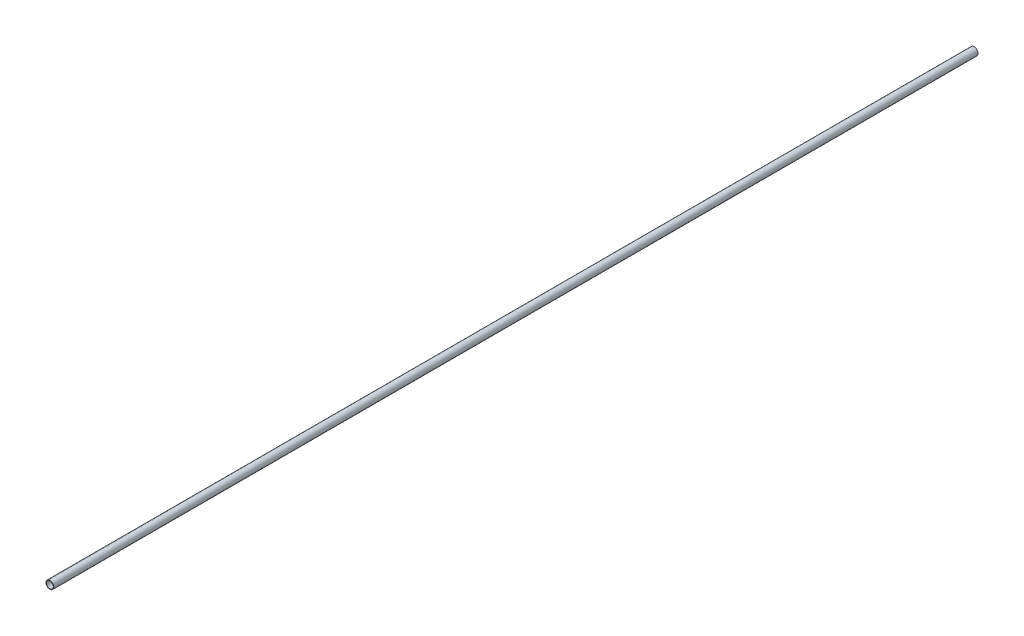
ISO-10303-21;
HEADER;
FILE_DESCRIPTION(('STEP AP214'),'2;1');
FILE_NAME('part.step','',(''),(''),'','','');
FILE_SCHEMA(('AUTOMOTIVE_DESIGN { 1 0 10303 214 1 1 1 1 }'));
ENDSEC;
DATA;
#1=APPLICATION_CONTEXT('core data for automotive mechanical design processes');
#2=APPLICATION_PROTOCOL_DEFINITION('international standard','automotive_design',2000,#1);
#3=PRODUCT_CONTEXT('',#1,'mechanical');
#4=PRODUCT('Part','Part','',(#3));
#5=PRODUCT_RELATED_PRODUCT_CATEGORY('part','',(#4));
#6=PRODUCT_DEFINITION_FORMATION('','',#4);
#7=PRODUCT_DEFINITION_CONTEXT('part definition',#1,'design');
#8=PRODUCT_DEFINITION('design','',#6,#7);
#9=PRODUCT_DEFINITION_SHAPE('','',#8);
#10=(LENGTH_UNIT() NAMED_UNIT(*) SI_UNIT(.MILLI.,.METRE.));
#11=(NAMED_UNIT(*) PLANE_ANGLE_UNIT() SI_UNIT($,.RADIAN.));
#12=(NAMED_UNIT(*) SI_UNIT($,.STERADIAN.) SOLID_ANGLE_UNIT());
#13=UNCERTAINTY_MEASURE_WITH_UNIT(LENGTH_MEASURE(1.E-05),#10,'distance_accuracy_value','');
#14=(GEOMETRIC_REPRESENTATION_CONTEXT(3) GLOBAL_UNCERTAINTY_ASSIGNED_CONTEXT((#13)) GLOBAL_UNIT_ASSIGNED_CONTEXT((#10,
#11,#12)) REPRESENTATION_CONTEXT('',''));
#15=CARTESIAN_POINT('',(0.,0.,0.));
#16=DIRECTION('',(0.,0.,1.));
#17=DIRECTION('',(1.,0.,0.));
#18=AXIS2_PLACEMENT_3D('',#15,#16,#17);
#19=CARTESIAN_POINT('',(0.,0.,-474.25));
#20=DIRECTION('',(0.,0.,1.));
#21=DIRECTION('',(1.,0.,0.));
#22=AXIS2_PLACEMENT_3D('',#19,#20,#21);
#23=CYLINDRICAL_SURFACE('',#22,4.);
#24=CARTESIAN_POINT('',(0.,0.,-474.25));
#25=DIRECTION('',(0.,0.,1.));
#26=DIRECTION('',(1.,0.,0.));
#27=AXIS2_PLACEMENT_3D('',#24,#25,#26);
#28=CIRCLE('',#27,4.);
#29=CARTESIAN_POINT('',(4.,0.,-474.25));
#30=VERTEX_POINT('',#29);
#31=EDGE_CURVE('E10',#30,#30,#28,.T.);
#32=ORIENTED_EDGE('',*,*,#31,.T.);
#33=EDGE_LOOP('',(#32));
#34=FACE_BOUND('',#33,.T.);
#35=CARTESIAN_POINT('',(0.,0.,474.25));
#36=DIRECTION('',(0.,0.,1.));
#37=DIRECTION('',(1.,0.,0.));
#38=AXIS2_PLACEMENT_3D('',#35,#36,#37);
#39=CIRCLE('',#38,4.);
#40=CARTESIAN_POINT('',(4.,0.,474.25));
#41=VERTEX_POINT('',#40);
#42=EDGE_CURVE('E42',#41,#41,#39,.T.);
#43=ORIENTED_EDGE('',*,*,#42,.F.);
#44=EDGE_LOOP('',(#43));
#45=FACE_BOUND('',#44,.T.);
#46=ADVANCED_FACE('F32',(#34,#45),#23,.T.);
#47=CARTESIAN_POINT('',(0.,0.,-474.25));
#48=DIRECTION('',(0.,0.,1.));
#49=DIRECTION('',(1.,0.,0.));
#50=AXIS2_PLACEMENT_3D('',#47,#48,#49);
#51=PLANE('',#50);
#52=CARTESIAN_POINT('',(0.,0.,-474.25));
#53=DIRECTION('',(0.,0.,1.));
#54=DIRECTION('',(1.,0.,0.));
#55=AXIS2_PLACEMENT_3D('',#52,#53,#54);
#56=CIRCLE('',#55,3.5);
#57=CARTESIAN_POINT('',(3.5,0.,-474.25));
#58=VERTEX_POINT('',#57);
#59=EDGE_CURVE('E38',#58,#58,#56,.T.);
#60=ORIENTED_EDGE('',*,*,#59,.T.);
#61=EDGE_LOOP('',(#60));
#62=FACE_BOUND('',#61,.T.);
#63=ORIENTED_EDGE('',*,*,#31,.F.);
#64=EDGE_LOOP('',(#63));
#65=FACE_BOUND('',#64,.T.);
#66=ADVANCED_FACE('F61',(#62,#65),#51,.F.);
#67=CARTESIAN_POINT('',(0.,0.,-474.25));
#68=DIRECTION('',(0.,0.,1.));
#69=DIRECTION('',(1.,0.,0.));
#70=AXIS2_PLACEMENT_3D('',#67,#68,#69);
#71=CYLINDRICAL_SURFACE('',#70,3.5);
#72=ORIENTED_EDGE('',*,*,#59,.F.);
#73=EDGE_LOOP('',(#72));
#74=FACE_BOUND('',#73,.T.);
#75=CARTESIAN_POINT('',(0.,0.,474.25));
#76=DIRECTION('',(0.,0.,1.));
#77=DIRECTION('',(1.,0.,0.));
#78=AXIS2_PLACEMENT_3D('',#75,#76,#77);
#79=CIRCLE('',#78,3.5);
#80=CARTESIAN_POINT('',(3.5,0.,474.25));
#81=VERTEX_POINT('',#80);
#82=EDGE_CURVE('E46',#81,#81,#79,.T.);
#83=ORIENTED_EDGE('',*,*,#82,.T.);
#84=EDGE_LOOP('',(#83));
#85=FACE_BOUND('',#84,.T.);
#86=ADVANCED_FACE('F52',(#74,#85),#71,.F.);
#87=CARTESIAN_POINT('',(0.,0.,474.25));
#88=DIRECTION('',(0.,0.,1.));
#89=DIRECTION('',(1.,0.,0.));
#90=AXIS2_PLACEMENT_3D('',#87,#88,#89);
#91=PLANE('',#90);
#92=ORIENTED_EDGE('',*,*,#42,.T.);
#93=EDGE_LOOP('',(#92));
#94=FACE_BOUND('',#93,.T.);
#95=ORIENTED_EDGE('',*,*,#82,.F.);
#96=EDGE_LOOP('',(#95));
#97=FACE_BOUND('',#96,.T.);
#98=ADVANCED_FACE('F54',(#94,#97),#91,.T.);
#99=CLOSED_SHELL('',(#46,#66,#86,#98));
#100=MANIFOLD_SOLID_BREP('B2',#99);
#101=ADVANCED_BREP_SHAPE_REPRESENTATION('',(#18,#100),#14);
#102=SHAPE_DEFINITION_REPRESENTATION(#9,#101);
ENDSEC;
END-ISO-10303-21;
